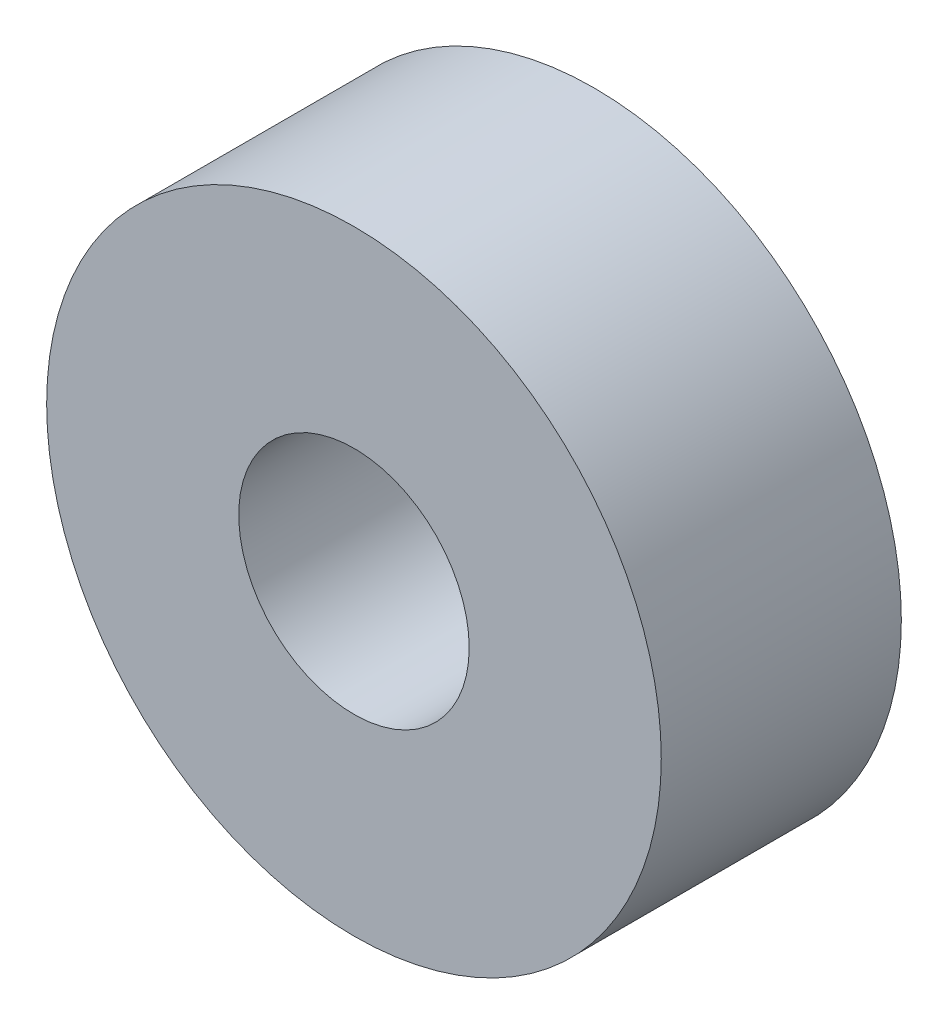
ISO-10303-21;
HEADER;
FILE_DESCRIPTION(('STEP AP214'),'2;1');
FILE_NAME('part.step','',(''),(''),'','','');
FILE_SCHEMA(('AUTOMOTIVE_DESIGN { 1 0 10303 214 1 1 1 1 }'));
ENDSEC;
DATA;
#1=APPLICATION_CONTEXT('core data for automotive mechanical design processes');
#2=APPLICATION_PROTOCOL_DEFINITION('international standard','automotive_design',2000,#1);
#3=PRODUCT_CONTEXT('',#1,'mechanical');
#4=PRODUCT('Part','Part','',(#3));
#5=PRODUCT_RELATED_PRODUCT_CATEGORY('part','',(#4));
#6=PRODUCT_DEFINITION_FORMATION('','',#4);
#7=PRODUCT_DEFINITION_CONTEXT('part definition',#1,'design');
#8=PRODUCT_DEFINITION('design','',#6,#7);
#9=PRODUCT_DEFINITION_SHAPE('','',#8);
#10=(LENGTH_UNIT() NAMED_UNIT(*) SI_UNIT(.MILLI.,.METRE.));
#11=(NAMED_UNIT(*) PLANE_ANGLE_UNIT() SI_UNIT($,.RADIAN.));
#12=(NAMED_UNIT(*) SI_UNIT($,.STERADIAN.) SOLID_ANGLE_UNIT());
#13=UNCERTAINTY_MEASURE_WITH_UNIT(LENGTH_MEASURE(1.E-05),#10,'distance_accuracy_value','');
#14=(GEOMETRIC_REPRESENTATION_CONTEXT(3) GLOBAL_UNCERTAINTY_ASSIGNED_CONTEXT((#13)) GLOBAL_UNIT_ASSIGNED_CONTEXT((#10,
#11,#12)) REPRESENTATION_CONTEXT('',''));
#15=CARTESIAN_POINT('',(0.,0.,0.));
#16=DIRECTION('',(0.,0.,1.));
#17=DIRECTION('',(1.,0.,0.));
#18=AXIS2_PLACEMENT_3D('',#15,#16,#17);
#19=CARTESIAN_POINT('',(0.,0.,5.));
#20=DIRECTION('',(0.,0.,1.));
#21=DIRECTION('',(1.,0.,0.));
#22=AXIS2_PLACEMENT_3D('',#19,#20,#21);
#23=PLANE('',#22);
#24=CARTESIAN_POINT('',(0.,0.,5.));
#25=DIRECTION('',(0.,0.,1.));
#26=DIRECTION('',(1.,0.,0.));
#27=AXIS2_PLACEMENT_3D('',#24,#25,#26);
#28=CIRCLE('',#27,6.4);
#29=CARTESIAN_POINT('',(6.4,0.,5.));
#30=VERTEX_POINT('',#29);
#31=EDGE_CURVE('E11',#30,#30,#28,.T.);
#32=ORIENTED_EDGE('',*,*,#31,.T.);
#33=EDGE_LOOP('',(#32));
#34=FACE_BOUND('',#33,.T.);
#35=CARTESIAN_POINT('',(0.,0.,5.));
#36=DIRECTION('',(0.,0.,1.));
#37=DIRECTION('',(1.,0.,0.));
#38=AXIS2_PLACEMENT_3D('',#35,#36,#37);
#39=CIRCLE('',#38,2.4);
#40=CARTESIAN_POINT('',(2.4,0.,5.));
#41=VERTEX_POINT('',#40);
#42=EDGE_CURVE('E56',#41,#41,#39,.T.);
#43=ORIENTED_EDGE('',*,*,#42,.F.);
#44=EDGE_LOOP('',(#43));
#45=FACE_BOUND('',#44,.T.);
#46=ADVANCED_FACE('F43',(#34,#45),#23,.T.);
#47=CARTESIAN_POINT('',(0.,0.,0.));
#48=DIRECTION('',(0.,0.,1.));
#49=DIRECTION('',(1.,0.,0.));
#50=AXIS2_PLACEMENT_3D('',#47,#48,#49);
#51=PLANE('',#50);
#52=CARTESIAN_POINT('',(0.,0.,0.));
#53=DIRECTION('',(0.,0.,1.));
#54=DIRECTION('',(1.,0.,0.));
#55=AXIS2_PLACEMENT_3D('',#52,#53,#54);
#56=CIRCLE('',#55,6.4);
#57=CARTESIAN_POINT('',(6.4,0.,0.));
#58=VERTEX_POINT('',#57);
#59=EDGE_CURVE('E47',#58,#58,#56,.T.);
#60=ORIENTED_EDGE('',*,*,#59,.F.);
#61=EDGE_LOOP('',(#60));
#62=FACE_BOUND('',#61,.T.);
#63=CARTESIAN_POINT('',(0.,0.,0.));
#64=DIRECTION('',(0.,0.,1.));
#65=DIRECTION('',(1.,0.,0.));
#66=AXIS2_PLACEMENT_3D('',#63,#64,#65);
#67=CIRCLE('',#66,2.4);
#68=CARTESIAN_POINT('',(2.4,0.,0.));
#69=VERTEX_POINT('',#68);
#70=EDGE_CURVE('E58',#69,#69,#67,.T.);
#71=ORIENTED_EDGE('',*,*,#70,.T.);
#72=EDGE_LOOP('',(#71));
#73=FACE_BOUND('',#72,.T.);
#74=ADVANCED_FACE('F70',(#62,#73),#51,.F.);
#75=CARTESIAN_POINT('',(0.,0.,5.));
#76=DIRECTION('',(0.,0.,-1.));
#77=DIRECTION('',(-1.,0.,0.));
#78=AXIS2_PLACEMENT_3D('',#75,#76,#77);
#79=CYLINDRICAL_SURFACE('',#78,6.4);
#80=ORIENTED_EDGE('',*,*,#31,.F.);
#81=EDGE_LOOP('',(#80));
#82=FACE_BOUND('',#81,.T.);
#83=ORIENTED_EDGE('',*,*,#59,.T.);
#84=EDGE_LOOP('',(#83));
#85=FACE_BOUND('',#84,.T.);
#86=ADVANCED_FACE('F45',(#82,#85),#79,.T.);
#87=CARTESIAN_POINT('',(0.,0.,5.));
#88=DIRECTION('',(0.,0.,-1.));
#89=DIRECTION('',(-1.,0.,0.));
#90=AXIS2_PLACEMENT_3D('',#87,#88,#89);
#91=CYLINDRICAL_SURFACE('',#90,2.4);
#92=ORIENTED_EDGE('',*,*,#42,.T.);
#93=EDGE_LOOP('',(#92));
#94=FACE_BOUND('',#93,.T.);
#95=ORIENTED_EDGE('',*,*,#70,.F.);
#96=EDGE_LOOP('',(#95));
#97=FACE_BOUND('',#96,.T.);
#98=ADVANCED_FACE('F66',(#94,#97),#91,.F.);
#99=CLOSED_SHELL('',(#46,#74,#86,#98));
#100=MANIFOLD_SOLID_BREP('B2',#99);
#101=ADVANCED_BREP_SHAPE_REPRESENTATION('',(#18,#100),#14);
#102=SHAPE_DEFINITION_REPRESENTATION(#9,#101);
ENDSEC;
END-ISO-10303-21;
